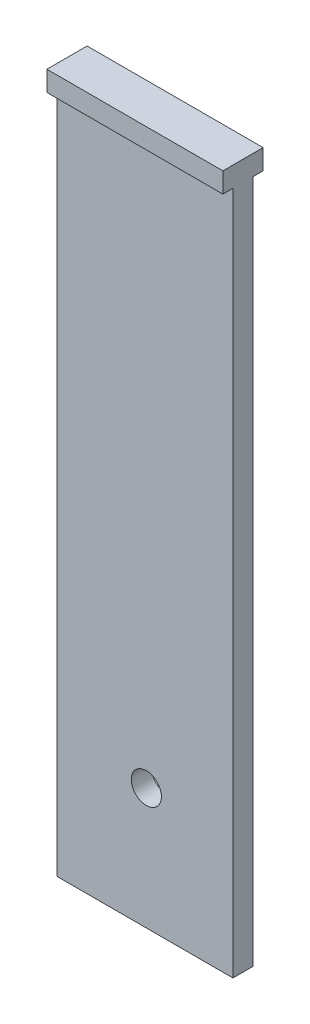
ISO-10303-21;
HEADER;
FILE_DESCRIPTION(('STEP AP214'),'2;1');
FILE_NAME('part.step','',(''),(''),'','','');
FILE_SCHEMA(('AUTOMOTIVE_DESIGN { 1 0 10303 214 1 1 1 1 }'));
ENDSEC;
DATA;
#1=APPLICATION_CONTEXT('core data for automotive mechanical design processes');
#2=APPLICATION_PROTOCOL_DEFINITION('international standard','automotive_design',2000,#1);
#3=PRODUCT_CONTEXT('',#1,'mechanical');
#4=PRODUCT('Part','Part','',(#3));
#5=PRODUCT_RELATED_PRODUCT_CATEGORY('part','',(#4));
#6=PRODUCT_DEFINITION_FORMATION('','',#4);
#7=PRODUCT_DEFINITION_CONTEXT('part definition',#1,'design');
#8=PRODUCT_DEFINITION('design','',#6,#7);
#9=PRODUCT_DEFINITION_SHAPE('','',#8);
#10=(LENGTH_UNIT() NAMED_UNIT(*) SI_UNIT(.MILLI.,.METRE.));
#11=(NAMED_UNIT(*) PLANE_ANGLE_UNIT() SI_UNIT($,.RADIAN.));
#12=(NAMED_UNIT(*) SI_UNIT($,.STERADIAN.) SOLID_ANGLE_UNIT());
#13=UNCERTAINTY_MEASURE_WITH_UNIT(LENGTH_MEASURE(1.E-05),#10,'distance_accuracy_value','');
#14=(GEOMETRIC_REPRESENTATION_CONTEXT(3) GLOBAL_UNCERTAINTY_ASSIGNED_CONTEXT((#13)) GLOBAL_UNIT_ASSIGNED_CONTEXT((#10,
#11,#12)) REPRESENTATION_CONTEXT('',''));
#15=CARTESIAN_POINT('',(0.,0.,0.));
#16=DIRECTION('',(0.,0.,1.));
#17=DIRECTION('',(1.,0.,0.));
#18=AXIS2_PLACEMENT_3D('',#15,#16,#17);
#19=CARTESIAN_POINT('',(0.,0.,4.));
#20=DIRECTION('',(0.,0.,-1.));
#21=DIRECTION('',(-1.,0.,0.));
#22=AXIS2_PLACEMENT_3D('',#19,#20,#21);
#23=PLANE('',#22);
#24=CARTESIAN_POINT('',(0.277177956354041,-45.9033413463677,4.));
#25=DIRECTION('',(0.,0.,1.));
#26=DIRECTION('',(1.,0.,0.));
#27=AXIS2_PLACEMENT_3D('',#24,#25,#26);
#28=CIRCLE('',#27,3.);
#29=CARTESIAN_POINT('',(3.27717795635404,-45.9033413463677,4.));
#30=VERTEX_POINT('',#29);
#31=EDGE_CURVE('E147',#30,#30,#28,.T.);
#32=ORIENTED_EDGE('',*,*,#31,.F.);
#33=EDGE_LOOP('',(#32));
#34=FACE_BOUND('',#33,.T.);
#35=DIRECTION('',(1.,0.,0.));
#36=VECTOR('',#35,1.);
#37=CARTESIAN_POINT('',(0.,66.,4.));
#38=LINE('',#37,#36);
#39=CARTESIAN_POINT('',(-17.5,66.,4.));
#40=VERTEX_POINT('',#39);
#41=CARTESIAN_POINT('',(17.5,66.,4.));
#42=VERTEX_POINT('',#41);
#43=EDGE_CURVE('E50',#40,#42,#38,.T.);
#44=ORIENTED_EDGE('',*,*,#43,.F.);
#45=DIRECTION('',(0.,-1.,0.));
#46=VECTOR('',#45,1.);
#47=CARTESIAN_POINT('',(-17.5,70.,4.));
#48=LINE('',#47,#46);
#49=CARTESIAN_POINT('',(-17.5,-70.,4.));
#50=VERTEX_POINT('',#49);
#51=EDGE_CURVE('E153',#40,#50,#48,.T.);
#52=ORIENTED_EDGE('',*,*,#51,.T.);
#53=DIRECTION('',(1.,0.,0.));
#54=VECTOR('',#53,1.);
#55=CARTESIAN_POINT('',(17.5,-70.,4.));
#56=LINE('',#55,#54);
#57=CARTESIAN_POINT('',(17.5,-70.,4.));
#58=VERTEX_POINT('',#57);
#59=EDGE_CURVE('E155',#50,#58,#56,.T.);
#60=ORIENTED_EDGE('',*,*,#59,.T.);
#61=DIRECTION('',(0.,1.,0.));
#62=VECTOR('',#61,1.);
#63=CARTESIAN_POINT('',(17.5,70.,4.));
#64=LINE('',#63,#62);
#65=EDGE_CURVE('E55',#58,#42,#64,.T.);
#66=ORIENTED_EDGE('',*,*,#65,.T.);
#67=EDGE_LOOP('',(#44,#52,#60,#66));
#68=FACE_BOUND('',#67,.T.);
#69=ADVANCED_FACE('F35',(#34,#68),#23,.F.);
#70=CARTESIAN_POINT('',(0.,0.,0.));
#71=DIRECTION('',(0.,0.,-1.));
#72=DIRECTION('',(-1.,0.,0.));
#73=AXIS2_PLACEMENT_3D('',#70,#71,#72);
#74=PLANE('',#73);
#75=CARTESIAN_POINT('',(0.277177956354041,-45.9033413463677,0.));
#76=DIRECTION('',(0.,0.,1.));
#77=DIRECTION('',(1.,0.,0.));
#78=AXIS2_PLACEMENT_3D('',#75,#76,#77);
#79=CIRCLE('',#78,3.);
#80=CARTESIAN_POINT('',(3.27717795635404,-45.9033413463677,0.));
#81=VERTEX_POINT('',#80);
#82=EDGE_CURVE('E146',#81,#81,#79,.T.);
#83=ORIENTED_EDGE('',*,*,#82,.T.);
#84=EDGE_LOOP('',(#83));
#85=FACE_BOUND('',#84,.T.);
#86=DIRECTION('',(0.,-1.,0.));
#87=VECTOR('',#86,1.);
#88=CARTESIAN_POINT('',(-17.5,70.,0.));
#89=LINE('',#88,#87);
#90=CARTESIAN_POINT('',(-17.5,66.,0.));
#91=VERTEX_POINT('',#90);
#92=CARTESIAN_POINT('',(-17.5,-70.,0.));
#93=VERTEX_POINT('',#92);
#94=EDGE_CURVE('E150',#91,#93,#89,.T.);
#95=ORIENTED_EDGE('',*,*,#94,.F.);
#96=DIRECTION('',(1.,0.,0.));
#97=VECTOR('',#96,1.);
#98=CARTESIAN_POINT('',(0.,66.,0.));
#99=LINE('',#98,#97);
#100=CARTESIAN_POINT('',(17.5,66.,0.));
#101=VERTEX_POINT('',#100);
#102=EDGE_CURVE('E139',#91,#101,#99,.T.);
#103=ORIENTED_EDGE('',*,*,#102,.T.);
#104=DIRECTION('',(0.,1.,0.));
#105=VECTOR('',#104,1.);
#106=CARTESIAN_POINT('',(17.5,70.,0.));
#107=LINE('',#106,#105);
#108=CARTESIAN_POINT('',(17.5,-70.,0.));
#109=VERTEX_POINT('',#108);
#110=EDGE_CURVE('E105',#109,#101,#107,.T.);
#111=ORIENTED_EDGE('',*,*,#110,.F.);
#112=DIRECTION('',(1.,0.,0.));
#113=VECTOR('',#112,1.);
#114=CARTESIAN_POINT('',(17.5,-70.,0.));
#115=LINE('',#114,#113);
#116=EDGE_CURVE('E160',#93,#109,#115,.T.);
#117=ORIENTED_EDGE('',*,*,#116,.F.);
#118=EDGE_LOOP('',(#95,#103,#111,#117));
#119=FACE_BOUND('',#118,.T.);
#120=ADVANCED_FACE('F171',(#85,#119),#74,.T.);
#121=CARTESIAN_POINT('',(-17.5,70.,4.));
#122=DIRECTION('',(1.,0.,0.));
#123=DIRECTION('',(0.,1.,0.));
#124=AXIS2_PLACEMENT_3D('',#121,#122,#123);
#125=PLANE('',#124);
#126=DIRECTION('',(0.,0.,-1.));
#127=VECTOR('',#126,1.);
#128=CARTESIAN_POINT('',(-17.5,70.,4.));
#129=LINE('',#128,#127);
#130=CARTESIAN_POINT('',(-17.5,70.,6.));
#131=VERTEX_POINT('',#130);
#132=CARTESIAN_POINT('',(-17.5,70.,-2.));
#133=VERTEX_POINT('',#132);
#134=EDGE_CURVE('E158',#131,#133,#129,.T.);
#135=ORIENTED_EDGE('',*,*,#134,.T.);
#136=DIRECTION('',(0.,1.,0.));
#137=VECTOR('',#136,1.);
#138=CARTESIAN_POINT('',(-17.5,66.,-2.));
#139=LINE('',#138,#137);
#140=CARTESIAN_POINT('',(-17.5,66.,-2.));
#141=VERTEX_POINT('',#140);
#142=EDGE_CURVE('E119',#141,#133,#139,.T.);
#143=ORIENTED_EDGE('',*,*,#142,.F.);
#144=DIRECTION('',(0.,0.,1.));
#145=VECTOR('',#144,1.);
#146=CARTESIAN_POINT('',(-17.5,66.,-2.));
#147=LINE('',#146,#145);
#148=EDGE_CURVE('E125',#141,#91,#147,.T.);
#149=ORIENTED_EDGE('',*,*,#148,.T.);
#150=ORIENTED_EDGE('',*,*,#94,.T.);
#151=DIRECTION('',(0.,0.,-1.));
#152=VECTOR('',#151,1.);
#153=CARTESIAN_POINT('',(-17.5,-70.,4.));
#154=LINE('',#153,#152);
#155=EDGE_CURVE('E11',#50,#93,#154,.T.);
#156=ORIENTED_EDGE('',*,*,#155,.F.);
#157=ORIENTED_EDGE('',*,*,#51,.F.);
#158=CARTESIAN_POINT('',(-17.5,66.,6.));
#159=VERTEX_POINT('',#158);
#160=EDGE_CURVE('E126',#40,#159,#147,.T.);
#161=ORIENTED_EDGE('',*,*,#160,.T.);
#162=DIRECTION('',(0.,1.,0.));
#163=VECTOR('',#162,1.);
#164=CARTESIAN_POINT('',(-17.5,66.,6.));
#165=LINE('',#164,#163);
#166=EDGE_CURVE('E140',#159,#131,#165,.T.);
#167=ORIENTED_EDGE('',*,*,#166,.T.);
#168=EDGE_LOOP('',(#135,#143,#149,#150,#156,#157,#161,#167));
#169=FACE_BOUND('',#168,.T.);
#170=ADVANCED_FACE('F37',(#169),#125,.F.);
#171=CARTESIAN_POINT('',(17.5,-70.,4.));
#172=DIRECTION('',(0.,1.,0.));
#173=DIRECTION('',(0.,0.,1.));
#174=AXIS2_PLACEMENT_3D('',#171,#172,#173);
#175=PLANE('',#174);
#176=ORIENTED_EDGE('',*,*,#116,.T.);
#177=DIRECTION('',(0.,0.,-1.));
#178=VECTOR('',#177,1.);
#179=CARTESIAN_POINT('',(17.5,-70.,4.));
#180=LINE('',#179,#178);
#181=EDGE_CURVE('E43',#58,#109,#180,.T.);
#182=ORIENTED_EDGE('',*,*,#181,.F.);
#183=ORIENTED_EDGE('',*,*,#59,.F.);
#184=ORIENTED_EDGE('',*,*,#155,.T.);
#185=EDGE_LOOP('',(#176,#182,#183,#184));
#186=FACE_BOUND('',#185,.T.);
#187=ADVANCED_FACE('F185',(#186),#175,.F.);
#188=CARTESIAN_POINT('',(17.5,70.,4.));
#189=DIRECTION('',(-1.,0.,0.));
#190=DIRECTION('',(0.,-1.,0.));
#191=AXIS2_PLACEMENT_3D('',#188,#189,#190);
#192=PLANE('',#191);
#193=DIRECTION('',(0.,0.,-1.));
#194=VECTOR('',#193,1.);
#195=CARTESIAN_POINT('',(17.5,70.,4.));
#196=LINE('',#195,#194);
#197=CARTESIAN_POINT('',(17.5,70.,6.));
#198=VERTEX_POINT('',#197);
#199=CARTESIAN_POINT('',(17.5,70.,-2.));
#200=VERTEX_POINT('',#199);
#201=EDGE_CURVE('E164',#198,#200,#196,.T.);
#202=ORIENTED_EDGE('',*,*,#201,.F.);
#203=DIRECTION('',(0.,1.,0.));
#204=VECTOR('',#203,1.);
#205=CARTESIAN_POINT('',(17.5,66.,6.));
#206=LINE('',#205,#204);
#207=CARTESIAN_POINT('',(17.5,66.,6.));
#208=VERTEX_POINT('',#207);
#209=EDGE_CURVE('E136',#208,#198,#206,.T.);
#210=ORIENTED_EDGE('',*,*,#209,.F.);
#211=DIRECTION('',(0.,0.,-1.));
#212=VECTOR('',#211,1.);
#213=CARTESIAN_POINT('',(17.5,66.,-2.));
#214=LINE('',#213,#212);
#215=EDGE_CURVE('E109',#208,#42,#214,.T.);
#216=ORIENTED_EDGE('',*,*,#215,.T.);
#217=ORIENTED_EDGE('',*,*,#65,.F.);
#218=ORIENTED_EDGE('',*,*,#181,.T.);
#219=ORIENTED_EDGE('',*,*,#110,.T.);
#220=CARTESIAN_POINT('',(17.5,66.,-2.));
#221=VERTEX_POINT('',#220);
#222=EDGE_CURVE('E98',#101,#221,#214,.T.);
#223=ORIENTED_EDGE('',*,*,#222,.T.);
#224=DIRECTION('',(0.,1.,0.));
#225=VECTOR('',#224,1.);
#226=CARTESIAN_POINT('',(17.5,66.,-2.));
#227=LINE('',#226,#225);
#228=EDGE_CURVE('E101',#221,#200,#227,.T.);
#229=ORIENTED_EDGE('',*,*,#228,.T.);
#230=EDGE_LOOP('',(#202,#210,#216,#217,#218,#219,#223,#229));
#231=FACE_BOUND('',#230,.T.);
#232=ADVANCED_FACE('F100',(#231),#192,.F.);
#233=CARTESIAN_POINT('',(17.5,70.,4.));
#234=DIRECTION('',(0.,-1.,0.));
#235=DIRECTION('',(1.,0.,0.));
#236=AXIS2_PLACEMENT_3D('',#233,#234,#235);
#237=PLANE('',#236);
#238=ORIENTED_EDGE('',*,*,#201,.T.);
#239=DIRECTION('',(-1.,0.,0.));
#240=VECTOR('',#239,1.);
#241=CARTESIAN_POINT('',(-17.5,70.,-2.));
#242=LINE('',#241,#240);
#243=EDGE_CURVE('E118',#200,#133,#242,.T.);
#244=ORIENTED_EDGE('',*,*,#243,.T.);
#245=ORIENTED_EDGE('',*,*,#134,.F.);
#246=DIRECTION('',(1.,0.,0.));
#247=VECTOR('',#246,1.);
#248=CARTESIAN_POINT('',(-17.5,70.,6.));
#249=LINE('',#248,#247);
#250=EDGE_CURVE('E110',#131,#198,#249,.T.);
#251=ORIENTED_EDGE('',*,*,#250,.T.);
#252=EDGE_LOOP('',(#238,#244,#245,#251));
#253=FACE_BOUND('',#252,.T.);
#254=ADVANCED_FACE('F175',(#253),#237,.F.);
#255=CARTESIAN_POINT('',(0.277177956354041,-45.9033413463677,4.));
#256=DIRECTION('',(0.,0.,-1.));
#257=DIRECTION('',(-1.,0.,0.));
#258=AXIS2_PLACEMENT_3D('',#255,#256,#257);
#259=CYLINDRICAL_SURFACE('',#258,3.);
#260=ORIENTED_EDGE('',*,*,#31,.T.);
#261=EDGE_LOOP('',(#260));
#262=FACE_BOUND('',#261,.T.);
#263=ORIENTED_EDGE('',*,*,#82,.F.);
#264=EDGE_LOOP('',(#263));
#265=FACE_BOUND('',#264,.T.);
#266=ADVANCED_FACE('F202',(#262,#265),#259,.F.);
#267=CARTESIAN_POINT('',(-17.5,66.,-2.));
#268=DIRECTION('',(0.,0.,-1.));
#269=DIRECTION('',(-1.,0.,0.));
#270=AXIS2_PLACEMENT_3D('',#267,#268,#269);
#271=PLANE('',#270);
#272=ORIENTED_EDGE('',*,*,#243,.F.);
#273=ORIENTED_EDGE('',*,*,#228,.F.);
#274=DIRECTION('',(-1.,0.,0.));
#275=VECTOR('',#274,1.);
#276=CARTESIAN_POINT('',(-17.5,66.,-2.));
#277=LINE('',#276,#275);
#278=EDGE_CURVE('E116',#221,#141,#277,.T.);
#279=ORIENTED_EDGE('',*,*,#278,.T.);
#280=ORIENTED_EDGE('',*,*,#142,.T.);
#281=EDGE_LOOP('',(#272,#273,#279,#280));
#282=FACE_BOUND('',#281,.T.);
#283=ADVANCED_FACE('F114',(#282),#271,.T.);
#284=CARTESIAN_POINT('',(0.,66.,0.));
#285=DIRECTION('',(0.,1.,0.));
#286=DIRECTION('',(0.,0.,1.));
#287=AXIS2_PLACEMENT_3D('',#284,#285,#286);
#288=PLANE('',#287);
#289=ORIENTED_EDGE('',*,*,#102,.F.);
#290=ORIENTED_EDGE('',*,*,#148,.F.);
#291=ORIENTED_EDGE('',*,*,#278,.F.);
#292=ORIENTED_EDGE('',*,*,#222,.F.);
#293=EDGE_LOOP('',(#289,#290,#291,#292));
#294=FACE_BOUND('',#293,.T.);
#295=ADVANCED_FACE('F123',(#294),#288,.F.);
#296=ORIENTED_EDGE('',*,*,#160,.F.);
#297=ORIENTED_EDGE('',*,*,#43,.T.);
#298=ORIENTED_EDGE('',*,*,#215,.F.);
#299=DIRECTION('',(1.,0.,0.));
#300=VECTOR('',#299,1.);
#301=CARTESIAN_POINT('',(-17.5,66.,6.));
#302=LINE('',#301,#300);
#303=EDGE_CURVE('E120',#159,#208,#302,.T.);
#304=ORIENTED_EDGE('',*,*,#303,.F.);
#305=EDGE_LOOP('',(#296,#297,#298,#304));
#306=FACE_BOUND('',#305,.T.);
#307=ADVANCED_FACE('F184',(#306),#288,.F.);
#308=CARTESIAN_POINT('',(-17.5,66.,6.));
#309=DIRECTION('',(0.,0.,1.));
#310=DIRECTION('',(1.,0.,0.));
#311=AXIS2_PLACEMENT_3D('',#308,#309,#310);
#312=PLANE('',#311);
#313=ORIENTED_EDGE('',*,*,#250,.F.);
#314=ORIENTED_EDGE('',*,*,#166,.F.);
#315=ORIENTED_EDGE('',*,*,#303,.T.);
#316=ORIENTED_EDGE('',*,*,#209,.T.);
#317=EDGE_LOOP('',(#313,#314,#315,#316));
#318=FACE_BOUND('',#317,.T.);
#319=ADVANCED_FACE('F179',(#318),#312,.T.);
#320=CLOSED_SHELL('',(#69,#120,#170,#187,#232,#254,#266,#283,#295,#307,#319));
#321=MANIFOLD_SOLID_BREP('B2',#320);
#322=ADVANCED_BREP_SHAPE_REPRESENTATION('',(#18,#321),#14);
#323=SHAPE_DEFINITION_REPRESENTATION(#9,#322);
ENDSEC;
END-ISO-10303-21;
